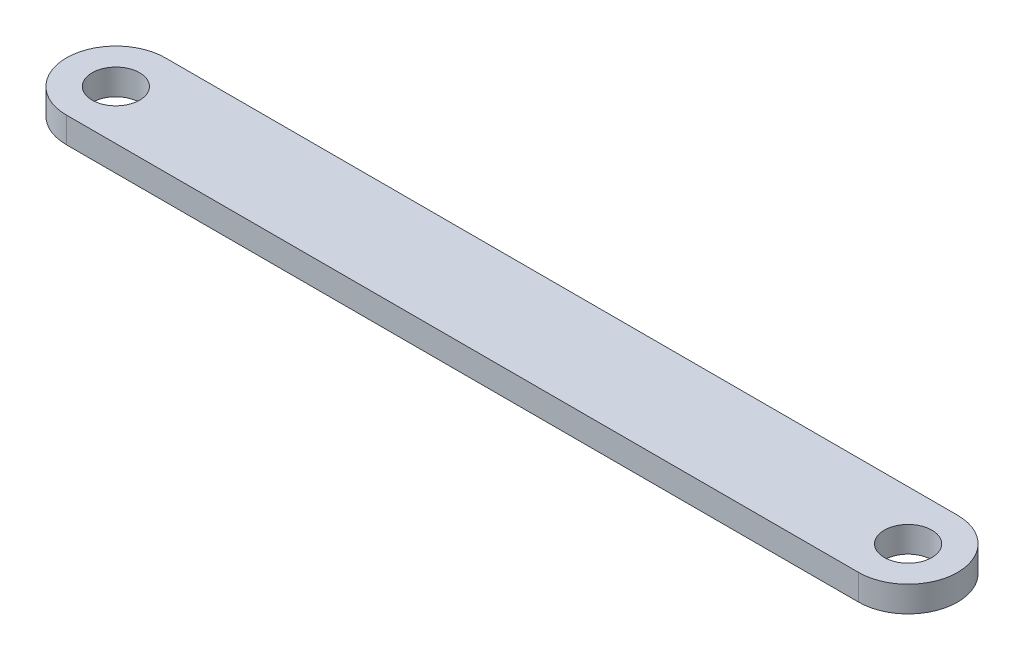
ISO-10303-21;
HEADER;
FILE_DESCRIPTION(('STEP AP214'),'2;1');
FILE_NAME('part.step','',(''),(''),'','','');
FILE_SCHEMA(('AUTOMOTIVE_DESIGN { 1 0 10303 214 1 1 1 1 }'));
ENDSEC;
DATA;
#1=APPLICATION_CONTEXT('core data for automotive mechanical design processes');
#2=APPLICATION_PROTOCOL_DEFINITION('international standard','automotive_design',2000,#1);
#3=PRODUCT_CONTEXT('',#1,'mechanical');
#4=PRODUCT('Part','Part','',(#3));
#5=PRODUCT_RELATED_PRODUCT_CATEGORY('part','',(#4));
#6=PRODUCT_DEFINITION_FORMATION('','',#4);
#7=PRODUCT_DEFINITION_CONTEXT('part definition',#1,'design');
#8=PRODUCT_DEFINITION('design','',#6,#7);
#9=PRODUCT_DEFINITION_SHAPE('','',#8);
#10=(LENGTH_UNIT() NAMED_UNIT(*) SI_UNIT(.MILLI.,.METRE.));
#11=(NAMED_UNIT(*) PLANE_ANGLE_UNIT() SI_UNIT($,.RADIAN.));
#12=(NAMED_UNIT(*) SI_UNIT($,.STERADIAN.) SOLID_ANGLE_UNIT());
#13=UNCERTAINTY_MEASURE_WITH_UNIT(LENGTH_MEASURE(1.E-05),#10,'distance_accuracy_value','');
#14=(GEOMETRIC_REPRESENTATION_CONTEXT(3) GLOBAL_UNCERTAINTY_ASSIGNED_CONTEXT((#13)) GLOBAL_UNIT_ASSIGNED_CONTEXT((#10,
#11,#12)) REPRESENTATION_CONTEXT('',''));
#15=CARTESIAN_POINT('',(0.,0.,0.));
#16=DIRECTION('',(0.,0.,1.));
#17=DIRECTION('',(1.,0.,0.));
#18=AXIS2_PLACEMENT_3D('',#15,#16,#17);
#19=CARTESIAN_POINT('',(0.,6.5,0.));
#20=DIRECTION('',(0.,1.,0.));
#21=DIRECTION('',(0.,0.,1.));
#22=AXIS2_PLACEMENT_3D('',#19,#20,#21);
#23=PLANE('',#22);
#24=CARTESIAN_POINT('',(0.,6.5,0.));
#25=DIRECTION('',(0.,1.,0.));
#26=DIRECTION('',(0.,0.,1.));
#27=AXIS2_PLACEMENT_3D('',#24,#25,#26);
#28=CIRCLE('',#27,6.);
#29=CARTESIAN_POINT('',(0.,6.5,-6.));
#30=VERTEX_POINT('',#29);
#31=EDGE_CURVE('E129',#30,#30,#28,.T.);
#32=ORIENTED_EDGE('',*,*,#31,.F.);
#33=EDGE_LOOP('',(#32));
#34=FACE_BOUND('',#33,.T.);
#35=CARTESIAN_POINT('',(0.,6.5,0.));
#36=DIRECTION('',(0.,1.,0.));
#37=DIRECTION('',(0.,0.,1.));
#38=AXIS2_PLACEMENT_3D('',#35,#36,#37);
#39=CIRCLE('',#38,12.5);
#40=CARTESIAN_POINT('',(0.,6.5,-12.5));
#41=VERTEX_POINT('',#40);
#42=CARTESIAN_POINT('',(0.,6.5,12.5));
#43=VERTEX_POINT('',#42);
#44=EDGE_CURVE('E113',#41,#43,#39,.T.);
#45=ORIENTED_EDGE('',*,*,#44,.T.);
#46=DIRECTION('',(1.,0.,0.));
#47=VECTOR('',#46,1.);
#48=CARTESIAN_POINT('',(0.,6.5,12.5));
#49=LINE('',#48,#47);
#50=CARTESIAN_POINT('',(200.,6.5,12.5));
#51=VERTEX_POINT('',#50);
#52=EDGE_CURVE('E106',#43,#51,#49,.T.);
#53=ORIENTED_EDGE('',*,*,#52,.T.);
#54=CARTESIAN_POINT('',(200.,6.5,0.));
#55=DIRECTION('',(0.,1.,0.));
#56=DIRECTION('',(0.,0.,1.));
#57=AXIS2_PLACEMENT_3D('',#54,#55,#56);
#58=CIRCLE('',#57,12.5);
#59=CARTESIAN_POINT('',(200.,6.5,-12.5));
#60=VERTEX_POINT('',#59);
#61=EDGE_CURVE('E112',#51,#60,#58,.T.);
#62=ORIENTED_EDGE('',*,*,#61,.T.);
#63=DIRECTION('',(1.,0.,0.));
#64=VECTOR('',#63,1.);
#65=CARTESIAN_POINT('',(0.,6.5,-12.5));
#66=LINE('',#65,#64);
#67=EDGE_CURVE('E122',#41,#60,#66,.T.);
#68=ORIENTED_EDGE('',*,*,#67,.F.);
#69=EDGE_LOOP('',(#45,#53,#62,#68));
#70=FACE_BOUND('',#69,.T.);
#71=CARTESIAN_POINT('',(200.,6.5,0.));
#72=DIRECTION('',(0.,1.,0.));
#73=DIRECTION('',(0.,0.,1.));
#74=AXIS2_PLACEMENT_3D('',#71,#72,#73);
#75=CIRCLE('',#74,6.00000000000002);
#76=CARTESIAN_POINT('',(200.,6.5,-6.00000000000002));
#77=VERTEX_POINT('',#76);
#78=EDGE_CURVE('E142',#77,#77,#75,.T.);
#79=ORIENTED_EDGE('',*,*,#78,.F.);
#80=EDGE_LOOP('',(#79));
#81=FACE_BOUND('',#80,.T.);
#82=ADVANCED_FACE('F63',(#34,#70,#81),#23,.T.);
#83=CARTESIAN_POINT('',(0.,0.,0.));
#84=DIRECTION('',(0.,1.,0.));
#85=DIRECTION('',(0.,0.,1.));
#86=AXIS2_PLACEMENT_3D('',#83,#84,#85);
#87=PLANE('',#86);
#88=CARTESIAN_POINT('',(0.,0.,0.));
#89=DIRECTION('',(0.,1.,0.));
#90=DIRECTION('',(0.,0.,1.));
#91=AXIS2_PLACEMENT_3D('',#88,#89,#90);
#92=CIRCLE('',#91,12.5);
#93=CARTESIAN_POINT('',(0.,0.,-12.5));
#94=VERTEX_POINT('',#93);
#95=CARTESIAN_POINT('',(0.,0.,12.5));
#96=VERTEX_POINT('',#95);
#97=EDGE_CURVE('E127',#94,#96,#92,.T.);
#98=ORIENTED_EDGE('',*,*,#97,.F.);
#99=DIRECTION('',(1.,0.,0.));
#100=VECTOR('',#99,1.);
#101=CARTESIAN_POINT('',(0.,0.,-12.5));
#102=LINE('',#101,#100);
#103=CARTESIAN_POINT('',(200.,0.,-12.5));
#104=VERTEX_POINT('',#103);
#105=EDGE_CURVE('E133',#94,#104,#102,.T.);
#106=ORIENTED_EDGE('',*,*,#105,.T.);
#107=CARTESIAN_POINT('',(200.,0.,0.));
#108=DIRECTION('',(0.,1.,0.));
#109=DIRECTION('',(0.,0.,1.));
#110=AXIS2_PLACEMENT_3D('',#107,#108,#109);
#111=CIRCLE('',#110,12.5);
#112=CARTESIAN_POINT('',(200.,0.,12.5));
#113=VERTEX_POINT('',#112);
#114=EDGE_CURVE('E131',#113,#104,#111,.T.);
#115=ORIENTED_EDGE('',*,*,#114,.F.);
#116=DIRECTION('',(1.,0.,0.));
#117=VECTOR('',#116,1.);
#118=CARTESIAN_POINT('',(0.,0.,12.5));
#119=LINE('',#118,#117);
#120=EDGE_CURVE('E118',#96,#113,#119,.T.);
#121=ORIENTED_EDGE('',*,*,#120,.F.);
#122=EDGE_LOOP('',(#98,#106,#115,#121));
#123=FACE_BOUND('',#122,.T.);
#124=CARTESIAN_POINT('',(0.,0.,0.));
#125=DIRECTION('',(0.,1.,0.));
#126=DIRECTION('',(0.,0.,1.));
#127=AXIS2_PLACEMENT_3D('',#124,#125,#126);
#128=CIRCLE('',#127,6.);
#129=CARTESIAN_POINT('',(0.,0.,-6.));
#130=VERTEX_POINT('',#129);
#131=EDGE_CURVE('E139',#130,#130,#128,.T.);
#132=ORIENTED_EDGE('',*,*,#131,.T.);
#133=EDGE_LOOP('',(#132));
#134=FACE_BOUND('',#133,.T.);
#135=CARTESIAN_POINT('',(200.,0.,0.));
#136=DIRECTION('',(0.,1.,0.));
#137=DIRECTION('',(0.,0.,1.));
#138=AXIS2_PLACEMENT_3D('',#135,#136,#137);
#139=CIRCLE('',#138,6.00000000000002);
#140=CARTESIAN_POINT('',(200.,0.,-6.00000000000002));
#141=VERTEX_POINT('',#140);
#142=EDGE_CURVE('E145',#141,#141,#139,.T.);
#143=ORIENTED_EDGE('',*,*,#142,.T.);
#144=EDGE_LOOP('',(#143));
#145=FACE_BOUND('',#144,.T.);
#146=ADVANCED_FACE('F154',(#123,#134,#145),#87,.F.);
#147=CARTESIAN_POINT('',(0.,6.5,0.));
#148=DIRECTION('',(0.,-1.,0.));
#149=DIRECTION('',(0.,0.,-1.));
#150=AXIS2_PLACEMENT_3D('',#147,#148,#149);
#151=CYLINDRICAL_SURFACE('',#150,12.5);
#152=ORIENTED_EDGE('',*,*,#97,.T.);
#153=DIRECTION('',(0.,-1.,0.));
#154=VECTOR('',#153,1.);
#155=CARTESIAN_POINT('',(0.,6.5,12.5));
#156=LINE('',#155,#154);
#157=EDGE_CURVE('E12',#43,#96,#156,.T.);
#158=ORIENTED_EDGE('',*,*,#157,.F.);
#159=ORIENTED_EDGE('',*,*,#44,.F.);
#160=DIRECTION('',(0.,-1.,0.));
#161=VECTOR('',#160,1.);
#162=CARTESIAN_POINT('',(0.,6.5,-12.5));
#163=LINE('',#162,#161);
#164=EDGE_CURVE('E80',#41,#94,#163,.T.);
#165=ORIENTED_EDGE('',*,*,#164,.T.);
#166=EDGE_LOOP('',(#152,#158,#159,#165));
#167=FACE_BOUND('',#166,.T.);
#168=ADVANCED_FACE('F65',(#167),#151,.T.);
#169=CARTESIAN_POINT('',(0.,6.5,12.5));
#170=DIRECTION('',(0.,0.,-1.));
#171=DIRECTION('',(-1.,0.,0.));
#172=AXIS2_PLACEMENT_3D('',#169,#170,#171);
#173=PLANE('',#172);
#174=ORIENTED_EDGE('',*,*,#120,.T.);
#175=DIRECTION('',(0.,-1.,0.));
#176=VECTOR('',#175,1.);
#177=CARTESIAN_POINT('',(200.,6.5,12.5));
#178=LINE('',#177,#176);
#179=EDGE_CURVE('E72',#51,#113,#178,.T.);
#180=ORIENTED_EDGE('',*,*,#179,.F.);
#181=ORIENTED_EDGE('',*,*,#52,.F.);
#182=ORIENTED_EDGE('',*,*,#157,.T.);
#183=EDGE_LOOP('',(#174,#180,#181,#182));
#184=FACE_BOUND('',#183,.T.);
#185=ADVANCED_FACE('F117',(#184),#173,.F.);
#186=CARTESIAN_POINT('',(200.,6.5,0.));
#187=DIRECTION('',(0.,-1.,0.));
#188=DIRECTION('',(0.,0.,-1.));
#189=AXIS2_PLACEMENT_3D('',#186,#187,#188);
#190=CYLINDRICAL_SURFACE('',#189,12.5);
#191=ORIENTED_EDGE('',*,*,#114,.T.);
#192=DIRECTION('',(0.,-1.,0.));
#193=VECTOR('',#192,1.);
#194=CARTESIAN_POINT('',(200.,6.5,-12.5));
#195=LINE('',#194,#193);
#196=EDGE_CURVE('E95',#60,#104,#195,.T.);
#197=ORIENTED_EDGE('',*,*,#196,.F.);
#198=ORIENTED_EDGE('',*,*,#61,.F.);
#199=ORIENTED_EDGE('',*,*,#179,.T.);
#200=EDGE_LOOP('',(#191,#197,#198,#199));
#201=FACE_BOUND('',#200,.T.);
#202=ADVANCED_FACE('F121',(#201),#190,.T.);
#203=CARTESIAN_POINT('',(0.,6.5,-12.5));
#204=DIRECTION('',(0.,0.,-1.));
#205=DIRECTION('',(-1.,0.,0.));
#206=AXIS2_PLACEMENT_3D('',#203,#204,#205);
#207=PLANE('',#206);
#208=ORIENTED_EDGE('',*,*,#105,.F.);
#209=ORIENTED_EDGE('',*,*,#164,.F.);
#210=ORIENTED_EDGE('',*,*,#67,.T.);
#211=ORIENTED_EDGE('',*,*,#196,.T.);
#212=EDGE_LOOP('',(#208,#209,#210,#211));
#213=FACE_BOUND('',#212,.T.);
#214=ADVANCED_FACE('F166',(#213),#207,.T.);
#215=CARTESIAN_POINT('',(0.,6.5,0.));
#216=DIRECTION('',(0.,-1.,0.));
#217=DIRECTION('',(0.,0.,-1.));
#218=AXIS2_PLACEMENT_3D('',#215,#216,#217);
#219=CYLINDRICAL_SURFACE('',#218,6.);
#220=CARTESIAN_POINT('',(0.,6.5,-6.));
#221=CARTESIAN_POINT('',(0.,6.43229166666667,-6.));
#222=CARTESIAN_POINT('',(0.,6.36458333333333,-6.));
#223=CARTESIAN_POINT('',(0.,6.22916666666667,-6.));
#224=CARTESIAN_POINT('',(0.,6.16145833333333,-6.));
#225=CARTESIAN_POINT('',(0.,6.02604166666667,-6.));
#226=CARTESIAN_POINT('',(0.,5.95833333333333,-6.));
#227=CARTESIAN_POINT('',(0.,5.82291666666667,-6.));
#228=CARTESIAN_POINT('',(0.,5.75520833333333,-6.));
#229=CARTESIAN_POINT('',(0.,5.61979166666667,-6.));
#230=CARTESIAN_POINT('',(0.,5.55208333333333,-6.));
#231=CARTESIAN_POINT('',(0.,5.41666666666667,-6.));
#232=CARTESIAN_POINT('',(0.,5.34895833333333,-6.));
#233=CARTESIAN_POINT('',(0.,5.21354166666667,-6.));
#234=CARTESIAN_POINT('',(0.,5.14583333333333,-6.));
#235=CARTESIAN_POINT('',(0.,5.01041666666667,-6.));
#236=CARTESIAN_POINT('',(0.,4.94270833333333,-6.));
#237=CARTESIAN_POINT('',(0.,4.80729166666667,-6.));
#238=CARTESIAN_POINT('',(0.,4.73958333333333,-6.));
#239=CARTESIAN_POINT('',(0.,4.60416666666667,-6.));
#240=CARTESIAN_POINT('',(0.,4.53645833333333,-6.));
#241=CARTESIAN_POINT('',(0.,4.40104166666667,-6.));
#242=CARTESIAN_POINT('',(0.,4.33333333333333,-6.));
#243=CARTESIAN_POINT('',(0.,4.19791666666667,-6.));
#244=CARTESIAN_POINT('',(0.,4.13020833333333,-6.));
#245=CARTESIAN_POINT('',(0.,3.99479166666667,-6.));
#246=CARTESIAN_POINT('',(0.,3.92708333333333,-6.));
#247=CARTESIAN_POINT('',(0.,3.79166666666667,-6.));
#248=CARTESIAN_POINT('',(0.,3.72395833333333,-6.));
#249=CARTESIAN_POINT('',(0.,3.58854166666667,-6.));
#250=CARTESIAN_POINT('',(0.,3.52083333333333,-6.));
#251=CARTESIAN_POINT('',(0.,3.38541666666667,-6.));
#252=CARTESIAN_POINT('',(0.,3.31770833333333,-6.));
#253=CARTESIAN_POINT('',(0.,3.18229166666667,-6.));
#254=CARTESIAN_POINT('',(0.,3.11458333333333,-6.));
#255=CARTESIAN_POINT('',(0.,2.97916666666667,-6.));
#256=CARTESIAN_POINT('',(0.,2.91145833333333,-6.));
#257=CARTESIAN_POINT('',(0.,2.77604166666667,-6.));
#258=CARTESIAN_POINT('',(0.,2.70833333333333,-6.));
#259=CARTESIAN_POINT('',(0.,2.57291666666667,-6.));
#260=CARTESIAN_POINT('',(0.,2.50520833333333,-6.));
#261=CARTESIAN_POINT('',(0.,2.36979166666667,-6.));
#262=CARTESIAN_POINT('',(0.,2.30208333333333,-6.));
#263=CARTESIAN_POINT('',(0.,2.16666666666667,-6.));
#264=CARTESIAN_POINT('',(0.,2.09895833333333,-6.));
#265=CARTESIAN_POINT('',(0.,1.96354166666667,-6.));
#266=CARTESIAN_POINT('',(0.,1.89583333333333,-6.));
#267=CARTESIAN_POINT('',(0.,1.76041666666667,-6.));
#268=CARTESIAN_POINT('',(0.,1.69270833333333,-6.));
#269=CARTESIAN_POINT('',(0.,1.55729166666667,-6.));
#270=CARTESIAN_POINT('',(0.,1.48958333333333,-6.));
#271=CARTESIAN_POINT('',(0.,1.35416666666667,-6.));
#272=CARTESIAN_POINT('',(0.,1.28645833333333,-6.));
#273=CARTESIAN_POINT('',(0.,1.15104166666667,-6.));
#274=CARTESIAN_POINT('',(0.,1.08333333333333,-6.));
#275=CARTESIAN_POINT('',(0.,0.947916666666667,-6.));
#276=CARTESIAN_POINT('',(0.,0.880208333333333,-6.));
#277=CARTESIAN_POINT('',(0.,0.744791666666667,-6.));
#278=CARTESIAN_POINT('',(0.,0.677083333333333,-6.));
#279=CARTESIAN_POINT('',(0.,0.541666666666667,-6.));
#280=CARTESIAN_POINT('',(0.,0.473958333333333,-6.));
#281=CARTESIAN_POINT('',(0.,0.338541666666667,-6.));
#282=CARTESIAN_POINT('',(0.,0.270833333333334,-6.));
#283=CARTESIAN_POINT('',(0.,0.135416666666667,-6.));
#284=CARTESIAN_POINT('',(0.,0.0677083333333334,-6.));
#285=CARTESIAN_POINT('',(0.,0.,-6.));
#286=B_SPLINE_CURVE_WITH_KNOTS('',3,(#220,#221,#222,#223,#224,#225,#226,#227,#228,#229,#230,
#231,#232,#233,#234,#235,#236,#237,#238,#239,#240,#241,#242,#243,#244,#245,#246,#247,#248,#249,
#250,#251,#252,#253,#254,#255,#256,#257,#258,#259,#260,#261,#262,#263,#264,#265,#266,#267,#268,
#269,#270,#271,#272,#273,#274,#275,#276,#277,#278,#279,#280,#281,#282,#283,#284,#285),
.UNSPECIFIED.,.F.,.F.,(4,2,2,2,2,2,2,2,2,2,2,2,2,2,2,2,2,2,2,2,2,2,2,2,2,2,2,2,2,2,2,2,4),(0.,
0.203125,0.40625,0.609375000000001,0.812500000000001,1.015625,1.21875,1.421875,1.625,1.828125,
2.03125,2.234375,2.4375,2.640625,2.84375,3.046875,3.25,3.453125,3.65625,3.859375,4.0625,
4.265625,4.46875,4.671875,4.875,5.078125,5.28125,5.484375,5.6875,5.890625,6.09375,6.296875,6.5),.UNSPECIFIED.);
#287=EDGE_CURVE('BSEAM163',#30,#130,#286,.T.);
#288=ORIENTED_EDGE('',*,*,#31,.T.);
#289=ORIENTED_EDGE('',*,*,#131,.F.);
#290=ORIENTED_EDGE('',*,*,#287,.T.);
#291=ORIENTED_EDGE('',*,*,#287,.F.);
#292=EDGE_LOOP('',(#288,#290,#289,#291));
#293=FACE_BOUND('',#292,.T.);
#294=ADVANCED_FACE('F163',(#293),#219,.F.);
#295=CARTESIAN_POINT('',(200.,6.5,0.));
#296=DIRECTION('',(0.,-1.,0.));
#297=DIRECTION('',(0.,0.,-1.));
#298=AXIS2_PLACEMENT_3D('',#295,#296,#297);
#299=CYLINDRICAL_SURFACE('',#298,6.00000000000002);
#300=CARTESIAN_POINT('',(200.,6.5,-6.00000000000002));
#301=CARTESIAN_POINT('',(200.,6.43229166666667,-6.00000000000002));
#302=CARTESIAN_POINT('',(200.,6.36458333333333,-6.00000000000002));
#303=CARTESIAN_POINT('',(200.,6.22916666666667,-6.00000000000002));
#304=CARTESIAN_POINT('',(200.,6.16145833333333,-6.00000000000002));
#305=CARTESIAN_POINT('',(200.,6.02604166666667,-6.00000000000002));
#306=CARTESIAN_POINT('',(200.,5.95833333333333,-6.00000000000002));
#307=CARTESIAN_POINT('',(200.,5.82291666666667,-6.00000000000002));
#308=CARTESIAN_POINT('',(200.,5.75520833333333,-6.00000000000002));
#309=CARTESIAN_POINT('',(200.,5.61979166666667,-6.00000000000002));
#310=CARTESIAN_POINT('',(200.,5.55208333333333,-6.00000000000002));
#311=CARTESIAN_POINT('',(200.,5.41666666666667,-6.00000000000002));
#312=CARTESIAN_POINT('',(200.,5.34895833333333,-6.00000000000002));
#313=CARTESIAN_POINT('',(200.,5.21354166666667,-6.00000000000002));
#314=CARTESIAN_POINT('',(200.,5.14583333333333,-6.00000000000002));
#315=CARTESIAN_POINT('',(200.,5.01041666666667,-6.00000000000002));
#316=CARTESIAN_POINT('',(200.,4.94270833333333,-6.00000000000002));
#317=CARTESIAN_POINT('',(200.,4.80729166666667,-6.00000000000002));
#318=CARTESIAN_POINT('',(200.,4.73958333333333,-6.00000000000002));
#319=CARTESIAN_POINT('',(200.,4.60416666666667,-6.00000000000002));
#320=CARTESIAN_POINT('',(200.,4.53645833333333,-6.00000000000002));
#321=CARTESIAN_POINT('',(200.,4.40104166666667,-6.00000000000002));
#322=CARTESIAN_POINT('',(200.,4.33333333333333,-6.00000000000002));
#323=CARTESIAN_POINT('',(200.,4.19791666666667,-6.00000000000002));
#324=CARTESIAN_POINT('',(200.,4.13020833333333,-6.00000000000002));
#325=CARTESIAN_POINT('',(200.,3.99479166666667,-6.00000000000002));
#326=CARTESIAN_POINT('',(200.,3.92708333333333,-6.00000000000002));
#327=CARTESIAN_POINT('',(200.,3.79166666666667,-6.00000000000002));
#328=CARTESIAN_POINT('',(200.,3.72395833333333,-6.00000000000002));
#329=CARTESIAN_POINT('',(200.,3.58854166666667,-6.00000000000002));
#330=CARTESIAN_POINT('',(200.,3.52083333333333,-6.00000000000002));
#331=CARTESIAN_POINT('',(200.,3.38541666666667,-6.00000000000002));
#332=CARTESIAN_POINT('',(200.,3.31770833333333,-6.00000000000002));
#333=CARTESIAN_POINT('',(200.,3.18229166666667,-6.00000000000002));
#334=CARTESIAN_POINT('',(200.,3.11458333333333,-6.00000000000002));
#335=CARTESIAN_POINT('',(200.,2.97916666666667,-6.00000000000002));
#336=CARTESIAN_POINT('',(200.,2.91145833333333,-6.00000000000002));
#337=CARTESIAN_POINT('',(200.,2.77604166666667,-6.00000000000002));
#338=CARTESIAN_POINT('',(200.,2.70833333333333,-6.00000000000002));
#339=CARTESIAN_POINT('',(200.,2.57291666666667,-6.00000000000002));
#340=CARTESIAN_POINT('',(200.,2.50520833333333,-6.00000000000002));
#341=CARTESIAN_POINT('',(200.,2.36979166666667,-6.00000000000002));
#342=CARTESIAN_POINT('',(200.,2.30208333333333,-6.00000000000002));
#343=CARTESIAN_POINT('',(200.,2.16666666666667,-6.00000000000002));
#344=CARTESIAN_POINT('',(200.,2.09895833333333,-6.00000000000002));
#345=CARTESIAN_POINT('',(200.,1.96354166666667,-6.00000000000002));
#346=CARTESIAN_POINT('',(200.,1.89583333333333,-6.00000000000002));
#347=CARTESIAN_POINT('',(200.,1.76041666666667,-6.00000000000002));
#348=CARTESIAN_POINT('',(200.,1.69270833333333,-6.00000000000002));
#349=CARTESIAN_POINT('',(200.,1.55729166666667,-6.00000000000002));
#350=CARTESIAN_POINT('',(200.,1.48958333333333,-6.00000000000002));
#351=CARTESIAN_POINT('',(200.,1.35416666666667,-6.00000000000002));
#352=CARTESIAN_POINT('',(200.,1.28645833333333,-6.00000000000002));
#353=CARTESIAN_POINT('',(200.,1.15104166666667,-6.00000000000002));
#354=CARTESIAN_POINT('',(200.,1.08333333333333,-6.00000000000002));
#355=CARTESIAN_POINT('',(200.,0.947916666666667,-6.00000000000002));
#356=CARTESIAN_POINT('',(200.,0.880208333333333,-6.00000000000002));
#357=CARTESIAN_POINT('',(200.,0.744791666666667,-6.00000000000002));
#358=CARTESIAN_POINT('',(200.,0.677083333333333,-6.00000000000002));
#359=CARTESIAN_POINT('',(200.,0.541666666666667,-6.00000000000002));
#360=CARTESIAN_POINT('',(200.,0.473958333333333,-6.00000000000002));
#361=CARTESIAN_POINT('',(200.,0.338541666666667,-6.00000000000002));
#362=CARTESIAN_POINT('',(200.,0.270833333333334,-6.00000000000002));
#363=CARTESIAN_POINT('',(200.,0.135416666666667,-6.00000000000002));
#364=CARTESIAN_POINT('',(200.,0.0677083333333334,-6.00000000000002));
#365=CARTESIAN_POINT('',(200.,0.,-6.00000000000002));
#366=B_SPLINE_CURVE_WITH_KNOTS('',3,(#300,#301,#302,#303,#304,#305,#306,#307,#308,#309,#310,
#311,#312,#313,#314,#315,#316,#317,#318,#319,#320,#321,#322,#323,#324,#325,#326,#327,#328,#329,
#330,#331,#332,#333,#334,#335,#336,#337,#338,#339,#340,#341,#342,#343,#344,#345,#346,#347,#348,
#349,#350,#351,#352,#353,#354,#355,#356,#357,#358,#359,#360,#361,#362,#363,#364,#365),
.UNSPECIFIED.,.F.,.F.,(4,2,2,2,2,2,2,2,2,2,2,2,2,2,2,2,2,2,2,2,2,2,2,2,2,2,2,2,2,2,2,2,4),(0.,
0.203125,0.40625,0.609375000000001,0.812500000000001,1.015625,1.21875,1.421875,1.625,1.828125,
2.03125,2.234375,2.4375,2.640625,2.84375,3.046875,3.25,3.453125,3.65625,3.859375,4.0625,
4.265625,4.46875,4.671875,4.875,5.078125,5.28125,5.484375,5.6875,5.890625,6.09375,6.296875,6.5),.UNSPECIFIED.);
#367=EDGE_CURVE('BSEAM151',#77,#141,#366,.T.);
#368=ORIENTED_EDGE('',*,*,#78,.T.);
#369=ORIENTED_EDGE('',*,*,#142,.F.);
#370=ORIENTED_EDGE('',*,*,#367,.T.);
#371=ORIENTED_EDGE('',*,*,#367,.F.);
#372=EDGE_LOOP('',(#368,#370,#369,#371));
#373=FACE_BOUND('',#372,.T.);
#374=ADVANCED_FACE('F151',(#373),#299,.F.);
#375=CLOSED_SHELL('',(#82,#146,#168,#185,#202,#214,#294,#374));
#376=MANIFOLD_SOLID_BREP('B2',#375);
#377=ADVANCED_BREP_SHAPE_REPRESENTATION('',(#18,#376),#14);
#378=SHAPE_DEFINITION_REPRESENTATION(#9,#377);
ENDSEC;
END-ISO-10303-21;
